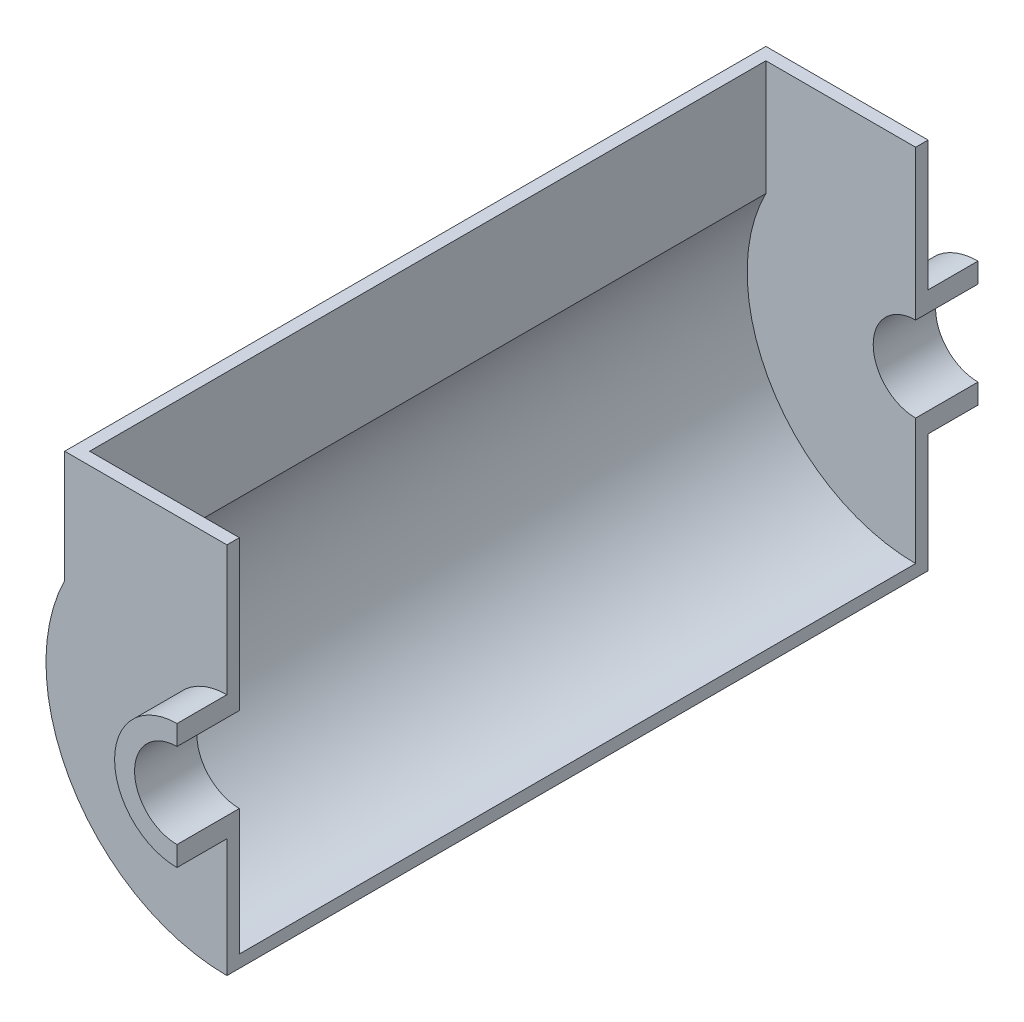
ISO-10303-21;
HEADER;
FILE_DESCRIPTION(('STEP AP214'),'2;1');
FILE_NAME('part.step','',(''),(''),'','','');
FILE_SCHEMA(('AUTOMOTIVE_DESIGN { 1 0 10303 214 1 1 1 1 }'));
ENDSEC;
DATA;
#1=APPLICATION_CONTEXT('core data for automotive mechanical design processes');
#2=APPLICATION_PROTOCOL_DEFINITION('international standard','automotive_design',2000,#1);
#3=PRODUCT_CONTEXT('',#1,'mechanical');
#4=PRODUCT('Part','Part','',(#3));
#5=PRODUCT_RELATED_PRODUCT_CATEGORY('part','',(#4));
#6=PRODUCT_DEFINITION_FORMATION('','',#4);
#7=PRODUCT_DEFINITION_CONTEXT('part definition',#1,'design');
#8=PRODUCT_DEFINITION('design','',#6,#7);
#9=PRODUCT_DEFINITION_SHAPE('','',#8);
#10=(LENGTH_UNIT() NAMED_UNIT(*) SI_UNIT(.MILLI.,.METRE.));
#11=(NAMED_UNIT(*) PLANE_ANGLE_UNIT() SI_UNIT($,.RADIAN.));
#12=(NAMED_UNIT(*) SI_UNIT($,.STERADIAN.) SOLID_ANGLE_UNIT());
#13=UNCERTAINTY_MEASURE_WITH_UNIT(LENGTH_MEASURE(1.E-05),#10,'distance_accuracy_value','');
#14=(GEOMETRIC_REPRESENTATION_CONTEXT(3) GLOBAL_UNCERTAINTY_ASSIGNED_CONTEXT((#13)) GLOBAL_UNIT_ASSIGNED_CONTEXT((#10,
#11,#12)) REPRESENTATION_CONTEXT('',''));
#15=CARTESIAN_POINT('',(0.,0.,0.));
#16=DIRECTION('',(0.,0.,1.));
#17=DIRECTION('',(1.,0.,0.));
#18=AXIS2_PLACEMENT_3D('',#15,#16,#17);
#19=CARTESIAN_POINT('',(0.,0.,-5.));
#20=DIRECTION('',(0.,0.,1.));
#21=DIRECTION('',(1.,0.,0.));
#22=AXIS2_PLACEMENT_3D('',#19,#20,#21);
#23=PLANE('',#22);
#24=CARTESIAN_POINT('',(0.,0.,-5.));
#25=DIRECTION('',(0.,0.,1.));
#26=DIRECTION('',(-1.,0.,0.));
#27=AXIS2_PLACEMENT_3D('',#24,#25,#26);
#28=CIRCLE('',#27,67.5);
#29=CARTESIAN_POINT('',(-60.,30.9232921921324,-5.));
#30=VERTEX_POINT('',#29);
#31=CARTESIAN_POINT('',(0.,-67.5,-5.));
#32=VERTEX_POINT('',#31);
#33=EDGE_CURVE('E201',#30,#32,#28,.T.);
#34=ORIENTED_EDGE('',*,*,#33,.F.);
#35=DIRECTION('',(0.,-1.,0.));
#36=VECTOR('',#35,1.);
#37=CARTESIAN_POINT('',(-60.,77.,-5.));
#38=LINE('',#37,#36);
#39=CARTESIAN_POINT('',(-60.,77.,-5.));
#40=VERTEX_POINT('',#39);
#41=EDGE_CURVE('E58',#40,#30,#38,.T.);
#42=ORIENTED_EDGE('',*,*,#41,.F.);
#43=DIRECTION('',(-1.,0.,0.));
#44=VECTOR('',#43,1.);
#45=CARTESIAN_POINT('',(0.,77.,-5.));
#46=LINE('',#45,#44);
#47=CARTESIAN_POINT('',(0.,77.,-5.));
#48=VERTEX_POINT('',#47);
#49=EDGE_CURVE('E217',#48,#40,#46,.T.);
#50=ORIENTED_EDGE('',*,*,#49,.F.);
#51=DIRECTION('',(0.,1.,0.));
#52=VECTOR('',#51,1.);
#53=CARTESIAN_POINT('',(0.,25.,-5.));
#54=LINE('',#53,#52);
#55=CARTESIAN_POINT('',(0.,17.,-5.));
#56=VERTEX_POINT('',#55);
#57=EDGE_CURVE('E259',#56,#48,#54,.T.);
#58=ORIENTED_EDGE('',*,*,#57,.F.);
#59=CARTESIAN_POINT('',(0.,0.,-5.));
#60=DIRECTION('',(0.,0.,-1.));
#61=DIRECTION('',(1.,0.,0.));
#62=AXIS2_PLACEMENT_3D('',#59,#60,#61);
#63=CIRCLE('',#62,17.);
#64=CARTESIAN_POINT('',(0.,-17.,-5.));
#65=VERTEX_POINT('',#64);
#66=EDGE_CURVE('E256',#65,#56,#63,.T.);
#67=ORIENTED_EDGE('',*,*,#66,.F.);
#68=DIRECTION('',(0.,1.,0.));
#69=VECTOR('',#68,1.);
#70=CARTESIAN_POINT('',(0.,-17.,-5.));
#71=LINE('',#70,#69);
#72=EDGE_CURVE('E64',#32,#65,#71,.T.);
#73=ORIENTED_EDGE('',*,*,#72,.F.);
#74=EDGE_LOOP('',(#34,#42,#50,#58,#67,#73));
#75=FACE_BOUND('',#74,.T.);
#76=ADVANCED_FACE('F41',(#75),#23,.F.);
#77=CARTESIAN_POINT('',(0.,0.,-5.));
#78=DIRECTION('',(0.,0.,1.));
#79=DIRECTION('',(1.,0.,0.));
#80=AXIS2_PLACEMENT_3D('',#77,#78,#79);
#81=CYLINDRICAL_SURFACE('',#80,17.);
#82=DIRECTION('',(0.,0.,1.));
#83=VECTOR('',#82,1.);
#84=CARTESIAN_POINT('',(0.,17.,-5.));
#85=LINE('',#84,#83);
#86=CARTESIAN_POINT('',(0.,17.,20.));
#87=VERTEX_POINT('',#86);
#88=EDGE_CURVE('E45',#56,#87,#85,.T.);
#89=ORIENTED_EDGE('',*,*,#88,.T.);
#90=CARTESIAN_POINT('',(0.,0.,20.));
#91=DIRECTION('',(0.,0.,-1.));
#92=DIRECTION('',(1.,0.,0.));
#93=AXIS2_PLACEMENT_3D('',#90,#91,#92);
#94=CIRCLE('',#93,17.);
#95=CARTESIAN_POINT('',(0.,-17.,20.));
#96=VERTEX_POINT('',#95);
#97=EDGE_CURVE('E239',#96,#87,#94,.T.);
#98=ORIENTED_EDGE('',*,*,#97,.F.);
#99=DIRECTION('',(0.,0.,1.));
#100=VECTOR('',#99,1.);
#101=CARTESIAN_POINT('',(0.,-17.,-5.));
#102=LINE('',#101,#100);
#103=EDGE_CURVE('E11',#65,#96,#102,.T.);
#104=ORIENTED_EDGE('',*,*,#103,.F.);
#105=ORIENTED_EDGE('',*,*,#66,.T.);
#106=EDGE_LOOP('',(#89,#98,#104,#105));
#107=FACE_BOUND('',#106,.T.);
#108=ADVANCED_FACE('F43',(#107),#81,.F.);
#109=CARTESIAN_POINT('',(0.,-17.,-5.));
#110=DIRECTION('',(1.,0.,0.));
#111=DIRECTION('',(0.,0.,-1.));
#112=AXIS2_PLACEMENT_3D('',#109,#110,#111);
#113=PLANE('',#112);
#114=ORIENTED_EDGE('',*,*,#103,.T.);
#115=DIRECTION('',(0.,1.,0.));
#116=VECTOR('',#115,1.);
#117=CARTESIAN_POINT('',(0.,-17.,20.));
#118=LINE('',#117,#116);
#119=CARTESIAN_POINT('',(0.,-25.,20.));
#120=VERTEX_POINT('',#119);
#121=EDGE_CURVE('E253',#120,#96,#118,.T.);
#122=ORIENTED_EDGE('',*,*,#121,.F.);
#123=DIRECTION('',(0.,0.,1.));
#124=VECTOR('',#123,1.);
#125=CARTESIAN_POINT('',(0.,-25.,-5.));
#126=LINE('',#125,#124);
#127=CARTESIAN_POINT('',(0.,-25.,0.));
#128=VERTEX_POINT('',#127);
#129=EDGE_CURVE('E50',#128,#120,#126,.T.);
#130=ORIENTED_EDGE('',*,*,#129,.F.);
#131=DIRECTION('',(0.,1.,0.));
#132=VECTOR('',#131,1.);
#133=CARTESIAN_POINT('',(0.,-25.,0.));
#134=LINE('',#133,#132);
#135=CARTESIAN_POINT('',(0.,-72.5,0.));
#136=VERTEX_POINT('',#135);
#137=EDGE_CURVE('E220',#136,#128,#134,.T.);
#138=ORIENTED_EDGE('',*,*,#137,.F.);
#139=DIRECTION('',(0.,0.,1.));
#140=VECTOR('',#139,1.);
#141=CARTESIAN_POINT('',(0.,-72.5,-5.));
#142=LINE('',#141,#140);
#143=CARTESIAN_POINT('',(0.,-72.5,-281.));
#144=VERTEX_POINT('',#143);
#145=EDGE_CURVE('E237',#144,#136,#142,.T.);
#146=ORIENTED_EDGE('',*,*,#145,.F.);
#147=DIRECTION('',(0.,1.,0.));
#148=VECTOR('',#147,1.);
#149=CARTESIAN_POINT('',(0.,-25.,-281.));
#150=LINE('',#149,#148);
#151=CARTESIAN_POINT('',(0.,-25.,-281.));
#152=VERTEX_POINT('',#151);
#153=EDGE_CURVE('E168',#144,#152,#150,.T.);
#154=ORIENTED_EDGE('',*,*,#153,.T.);
#155=DIRECTION('',(0.,0.,-1.));
#156=VECTOR('',#155,1.);
#157=CARTESIAN_POINT('',(0.,-25.,-276.));
#158=LINE('',#157,#156);
#159=CARTESIAN_POINT('',(0.,-25.,-301.));
#160=VERTEX_POINT('',#159);
#161=EDGE_CURVE('E194',#152,#160,#158,.T.);
#162=ORIENTED_EDGE('',*,*,#161,.T.);
#163=DIRECTION('',(0.,1.,0.));
#164=VECTOR('',#163,1.);
#165=CARTESIAN_POINT('',(0.,-17.,-301.));
#166=LINE('',#165,#164);
#167=CARTESIAN_POINT('',(0.,-17.,-301.));
#168=VERTEX_POINT('',#167);
#169=EDGE_CURVE('E187',#160,#168,#166,.T.);
#170=ORIENTED_EDGE('',*,*,#169,.T.);
#171=DIRECTION('',(0.,0.,-1.));
#172=VECTOR('',#171,1.);
#173=CARTESIAN_POINT('',(0.,-17.,-276.));
#174=LINE('',#173,#172);
#175=CARTESIAN_POINT('',(0.,-17.,-276.));
#176=VERTEX_POINT('',#175);
#177=EDGE_CURVE('E191',#176,#168,#174,.T.);
#178=ORIENTED_EDGE('',*,*,#177,.F.);
#179=DIRECTION('',(0.,1.,0.));
#180=VECTOR('',#179,1.);
#181=CARTESIAN_POINT('',(0.,-17.,-276.));
#182=LINE('',#181,#180);
#183=CARTESIAN_POINT('',(0.,-67.5,-276.));
#184=VERTEX_POINT('',#183);
#185=EDGE_CURVE('E183',#184,#176,#182,.T.);
#186=ORIENTED_EDGE('',*,*,#185,.F.);
#187=DIRECTION('',(0.,0.,1.));
#188=VECTOR('',#187,1.);
#189=CARTESIAN_POINT('',(0.,-67.5,-442.152038807834));
#190=LINE('',#189,#188);
#191=EDGE_CURVE('E204',#184,#32,#190,.T.);
#192=ORIENTED_EDGE('',*,*,#191,.T.);
#193=ORIENTED_EDGE('',*,*,#72,.T.);
#194=EDGE_LOOP('',(#114,#122,#130,#138,#146,#154,#162,#170,#178,#186,#192,#193));
#195=FACE_BOUND('',#194,.T.);
#196=ADVANCED_FACE('F277',(#195),#113,.T.);
#197=CARTESIAN_POINT('',(0.,0.,-5.));
#198=DIRECTION('',(0.,0.,1.));
#199=DIRECTION('',(1.,0.,0.));
#200=AXIS2_PLACEMENT_3D('',#197,#198,#199);
#201=CYLINDRICAL_SURFACE('',#200,25.);
#202=CARTESIAN_POINT('',(0.,0.,0.));
#203=DIRECTION('',(0.,0.,-1.));
#204=DIRECTION('',(1.,0.,0.));
#205=AXIS2_PLACEMENT_3D('',#202,#203,#204);
#206=CIRCLE('',#205,25.);
#207=CARTESIAN_POINT('',(0.,25.,0.));
#208=VERTEX_POINT('',#207);
#209=EDGE_CURVE('E210',#128,#208,#206,.T.);
#210=ORIENTED_EDGE('',*,*,#209,.F.);
#211=ORIENTED_EDGE('',*,*,#129,.T.);
#212=CARTESIAN_POINT('',(0.,0.,20.));
#213=DIRECTION('',(0.,0.,1.));
#214=DIRECTION('',(1.,0.,0.));
#215=AXIS2_PLACEMENT_3D('',#212,#213,#214);
#216=CIRCLE('',#215,25.);
#217=CARTESIAN_POINT('',(0.,25.,20.));
#218=VERTEX_POINT('',#217);
#219=EDGE_CURVE('E250',#218,#120,#216,.T.);
#220=ORIENTED_EDGE('',*,*,#219,.F.);
#221=DIRECTION('',(0.,0.,1.));
#222=VECTOR('',#221,1.);
#223=CARTESIAN_POINT('',(0.,25.,-5.));
#224=LINE('',#223,#222);
#225=EDGE_CURVE('E262',#208,#218,#224,.T.);
#226=ORIENTED_EDGE('',*,*,#225,.F.);
#227=EDGE_LOOP('',(#210,#211,#220,#226));
#228=FACE_BOUND('',#227,.T.);
#229=ADVANCED_FACE('F284',(#228),#201,.T.);
#230=CARTESIAN_POINT('',(0.,25.,-5.));
#231=DIRECTION('',(1.,0.,0.));
#232=DIRECTION('',(0.,0.,-1.));
#233=AXIS2_PLACEMENT_3D('',#230,#231,#232);
#234=PLANE('',#233);
#235=ORIENTED_EDGE('',*,*,#57,.T.);
#236=DIRECTION('',(0.,0.,1.));
#237=VECTOR('',#236,1.);
#238=CARTESIAN_POINT('',(0.,77.,-5.));
#239=LINE('',#238,#237);
#240=CARTESIAN_POINT('',(0.,77.,0.));
#241=VERTEX_POINT('',#240);
#242=EDGE_CURVE('E219',#48,#241,#239,.T.);
#243=ORIENTED_EDGE('',*,*,#242,.T.);
#244=DIRECTION('',(0.,1.,0.));
#245=VECTOR('',#244,1.);
#246=CARTESIAN_POINT('',(0.,25.,0.));
#247=LINE('',#246,#245);
#248=EDGE_CURVE('E223',#208,#241,#247,.T.);
#249=ORIENTED_EDGE('',*,*,#248,.F.);
#250=ORIENTED_EDGE('',*,*,#225,.T.);
#251=DIRECTION('',(0.,1.,0.));
#252=VECTOR('',#251,1.);
#253=CARTESIAN_POINT('',(0.,25.,20.));
#254=LINE('',#253,#252);
#255=EDGE_CURVE('E247',#87,#218,#254,.T.);
#256=ORIENTED_EDGE('',*,*,#255,.F.);
#257=ORIENTED_EDGE('',*,*,#88,.F.);
#258=EDGE_LOOP('',(#235,#243,#249,#250,#256,#257));
#259=FACE_BOUND('',#258,.T.);
#260=ADVANCED_FACE('F270',(#259),#234,.T.);
#261=CARTESIAN_POINT('',(0.,0.,20.));
#262=DIRECTION('',(0.,0.,1.));
#263=DIRECTION('',(1.,0.,0.));
#264=AXIS2_PLACEMENT_3D('',#261,#262,#263);
#265=PLANE('',#264);
#266=ORIENTED_EDGE('',*,*,#97,.T.);
#267=ORIENTED_EDGE('',*,*,#255,.T.);
#268=ORIENTED_EDGE('',*,*,#219,.T.);
#269=ORIENTED_EDGE('',*,*,#121,.T.);
#270=EDGE_LOOP('',(#266,#267,#268,#269));
#271=FACE_BOUND('',#270,.T.);
#272=ADVANCED_FACE('F273',(#271),#265,.T.);
#273=CARTESIAN_POINT('',(0.,0.,-5.));
#274=DIRECTION('',(0.,0.,1.));
#275=DIRECTION('',(1.,0.,0.));
#276=AXIS2_PLACEMENT_3D('',#273,#274,#275);
#277=CYLINDRICAL_SURFACE('',#276,72.5);
#278=CARTESIAN_POINT('',(0.,0.,0.));
#279=DIRECTION('',(0.,0.,1.));
#280=DIRECTION('',(1.,0.,0.));
#281=AXIS2_PLACEMENT_3D('',#278,#279,#280);
#282=CIRCLE('',#281,72.5);
#283=CARTESIAN_POINT('',(-65.,32.1130814466628,0.));
#284=VERTEX_POINT('',#283);
#285=EDGE_CURVE('E232',#284,#136,#282,.T.);
#286=ORIENTED_EDGE('',*,*,#285,.F.);
#287=DIRECTION('',(0.,0.,1.));
#288=VECTOR('',#287,1.);
#289=CARTESIAN_POINT('',(-65.,32.1130814466628,-5.));
#290=LINE('',#289,#288);
#291=CARTESIAN_POINT('',(-65.,32.1130814466628,-281.));
#292=VERTEX_POINT('',#291);
#293=EDGE_CURVE('E240',#292,#284,#290,.T.);
#294=ORIENTED_EDGE('',*,*,#293,.F.);
#295=CARTESIAN_POINT('',(0.,0.,-281.));
#296=DIRECTION('',(0.,0.,1.));
#297=DIRECTION('',(1.,0.,0.));
#298=AXIS2_PLACEMENT_3D('',#295,#296,#297);
#299=CIRCLE('',#298,72.5);
#300=EDGE_CURVE('E352',#292,#144,#299,.T.);
#301=ORIENTED_EDGE('',*,*,#300,.T.);
#302=ORIENTED_EDGE('',*,*,#145,.T.);
#303=EDGE_LOOP('',(#286,#294,#301,#302));
#304=FACE_BOUND('',#303,.T.);
#305=ADVANCED_FACE('F301',(#304),#277,.T.);
#306=CARTESIAN_POINT('',(-65.,77.,-5.));
#307=DIRECTION('',(-1.,0.,0.));
#308=DIRECTION('',(0.,-1.,0.));
#309=AXIS2_PLACEMENT_3D('',#306,#307,#308);
#310=PLANE('',#309);
#311=DIRECTION('',(0.,-1.,0.));
#312=VECTOR('',#311,1.);
#313=CARTESIAN_POINT('',(-65.,77.,0.));
#314=LINE('',#313,#312);
#315=CARTESIAN_POINT('',(-65.,77.,0.));
#316=VERTEX_POINT('',#315);
#317=EDGE_CURVE('E229',#316,#284,#314,.T.);
#318=ORIENTED_EDGE('',*,*,#317,.F.);
#319=DIRECTION('',(0.,0.,1.));
#320=VECTOR('',#319,1.);
#321=CARTESIAN_POINT('',(-65.,77.,-5.));
#322=LINE('',#321,#320);
#323=CARTESIAN_POINT('',(-65.,77.,-281.));
#324=VERTEX_POINT('',#323);
#325=EDGE_CURVE('E242',#324,#316,#322,.T.);
#326=ORIENTED_EDGE('',*,*,#325,.F.);
#327=DIRECTION('',(0.,-1.,0.));
#328=VECTOR('',#327,1.);
#329=CARTESIAN_POINT('',(-65.,77.,-281.));
#330=LINE('',#329,#328);
#331=EDGE_CURVE('E354',#324,#292,#330,.T.);
#332=ORIENTED_EDGE('',*,*,#331,.T.);
#333=ORIENTED_EDGE('',*,*,#293,.T.);
#334=EDGE_LOOP('',(#318,#326,#332,#333));
#335=FACE_BOUND('',#334,.T.);
#336=ADVANCED_FACE('F304',(#335),#310,.T.);
#337=CARTESIAN_POINT('',(0.,77.,-5.));
#338=DIRECTION('',(0.,1.,0.));
#339=DIRECTION('',(-1.,0.,0.));
#340=AXIS2_PLACEMENT_3D('',#337,#338,#339);
#341=PLANE('',#340);
#342=DIRECTION('',(-1.,0.,0.));
#343=VECTOR('',#342,1.);
#344=CARTESIAN_POINT('',(0.,77.,0.));
#345=LINE('',#344,#343);
#346=EDGE_CURVE('E226',#241,#316,#345,.T.);
#347=ORIENTED_EDGE('',*,*,#346,.F.);
#348=ORIENTED_EDGE('',*,*,#242,.F.);
#349=ORIENTED_EDGE('',*,*,#49,.T.);
#350=DIRECTION('',(0.,0.,1.));
#351=VECTOR('',#350,1.);
#352=CARTESIAN_POINT('',(-60.,77.,-442.152038807834));
#353=LINE('',#352,#351);
#354=CARTESIAN_POINT('',(-60.,77.,-276.));
#355=VERTEX_POINT('',#354);
#356=EDGE_CURVE('E164',#355,#40,#353,.T.);
#357=ORIENTED_EDGE('',*,*,#356,.F.);
#358=DIRECTION('',(-1.,0.,0.));
#359=VECTOR('',#358,1.);
#360=CARTESIAN_POINT('',(0.,77.,-276.));
#361=LINE('',#360,#359);
#362=CARTESIAN_POINT('',(0.,77.,-276.));
#363=VERTEX_POINT('',#362);
#364=EDGE_CURVE('E156',#363,#355,#361,.T.);
#365=ORIENTED_EDGE('',*,*,#364,.F.);
#366=DIRECTION('',(0.,0.,-1.));
#367=VECTOR('',#366,1.);
#368=CARTESIAN_POINT('',(0.,77.,-276.));
#369=LINE('',#368,#367);
#370=CARTESIAN_POINT('',(0.,77.,-281.));
#371=VERTEX_POINT('',#370);
#372=EDGE_CURVE('E161',#363,#371,#369,.T.);
#373=ORIENTED_EDGE('',*,*,#372,.T.);
#374=DIRECTION('',(-1.,0.,0.));
#375=VECTOR('',#374,1.);
#376=CARTESIAN_POINT('',(0.,77.,-281.));
#377=LINE('',#376,#375);
#378=EDGE_CURVE('E368',#371,#324,#377,.T.);
#379=ORIENTED_EDGE('',*,*,#378,.T.);
#380=ORIENTED_EDGE('',*,*,#325,.T.);
#381=EDGE_LOOP('',(#347,#348,#349,#357,#365,#373,#379,#380));
#382=FACE_BOUND('',#381,.T.);
#383=ADVANCED_FACE('F159',(#382),#341,.T.);
#384=CARTESIAN_POINT('',(0.,0.,0.));
#385=DIRECTION('',(0.,0.,1.));
#386=DIRECTION('',(1.,0.,0.));
#387=AXIS2_PLACEMENT_3D('',#384,#385,#386);
#388=PLANE('',#387);
#389=ORIENTED_EDGE('',*,*,#209,.T.);
#390=ORIENTED_EDGE('',*,*,#248,.T.);
#391=ORIENTED_EDGE('',*,*,#346,.T.);
#392=ORIENTED_EDGE('',*,*,#317,.T.);
#393=ORIENTED_EDGE('',*,*,#285,.T.);
#394=ORIENTED_EDGE('',*,*,#137,.T.);
#395=EDGE_LOOP('',(#389,#390,#391,#392,#393,#394));
#396=FACE_BOUND('',#395,.T.);
#397=ADVANCED_FACE('F282',(#396),#388,.T.);
#398=CARTESIAN_POINT('',(-60.,77.,-442.152038807834));
#399=DIRECTION('',(-1.,0.,0.));
#400=DIRECTION('',(0.,0.,1.));
#401=AXIS2_PLACEMENT_3D('',#398,#399,#400);
#402=PLANE('',#401);
#403=DIRECTION('',(0.,-1.,0.));
#404=VECTOR('',#403,1.);
#405=CARTESIAN_POINT('',(-60.,77.,-276.));
#406=LINE('',#405,#404);
#407=CARTESIAN_POINT('',(-60.,30.9232921921324,-276.));
#408=VERTEX_POINT('',#407);
#409=EDGE_CURVE('E211',#355,#408,#406,.T.);
#410=ORIENTED_EDGE('',*,*,#409,.F.);
#411=ORIENTED_EDGE('',*,*,#356,.T.);
#412=ORIENTED_EDGE('',*,*,#41,.T.);
#413=DIRECTION('',(0.,0.,1.));
#414=VECTOR('',#413,1.);
#415=CARTESIAN_POINT('',(-60.,30.9232921921324,-442.152038807834));
#416=LINE('',#415,#414);
#417=EDGE_CURVE('E205',#408,#30,#416,.T.);
#418=ORIENTED_EDGE('',*,*,#417,.F.);
#419=EDGE_LOOP('',(#410,#411,#412,#418));
#420=FACE_BOUND('',#419,.T.);
#421=ADVANCED_FACE('F312',(#420),#402,.F.);
#422=CARTESIAN_POINT('',(0.,0.,-442.152038807834));
#423=DIRECTION('',(0.,0.,1.));
#424=DIRECTION('',(1.,0.,0.));
#425=AXIS2_PLACEMENT_3D('',#422,#423,#424);
#426=CYLINDRICAL_SURFACE('',#425,67.5);
#427=CARTESIAN_POINT('',(0.,0.,-276.));
#428=DIRECTION('',(0.,0.,-1.));
#429=DIRECTION('',(-1.,0.,0.));
#430=AXIS2_PLACEMENT_3D('',#427,#428,#429);
#431=CIRCLE('',#430,67.5);
#432=EDGE_CURVE('E207',#408,#184,#431,.F.);
#433=ORIENTED_EDGE('',*,*,#432,.F.);
#434=ORIENTED_EDGE('',*,*,#417,.T.);
#435=ORIENTED_EDGE('',*,*,#33,.T.);
#436=ORIENTED_EDGE('',*,*,#191,.F.);
#437=EDGE_LOOP('',(#433,#434,#435,#436));
#438=FACE_BOUND('',#437,.T.);
#439=ADVANCED_FACE('F315',(#438),#426,.F.);
#440=CARTESIAN_POINT('',(0.,0.,-276.));
#441=DIRECTION('',(0.,0.,-1.));
#442=DIRECTION('',(1.,0.,0.));
#443=AXIS2_PLACEMENT_3D('',#440,#441,#442);
#444=PLANE('',#443);
#445=ORIENTED_EDGE('',*,*,#364,.T.);
#446=ORIENTED_EDGE('',*,*,#409,.T.);
#447=ORIENTED_EDGE('',*,*,#432,.T.);
#448=ORIENTED_EDGE('',*,*,#185,.T.);
#449=CARTESIAN_POINT('',(0.,0.,-276.));
#450=DIRECTION('',(0.,0.,-1.));
#451=DIRECTION('',(1.,0.,0.));
#452=AXIS2_PLACEMENT_3D('',#449,#450,#451);
#453=CIRCLE('',#452,17.);
#454=CARTESIAN_POINT('',(0.,17.,-276.));
#455=VERTEX_POINT('',#454);
#456=EDGE_CURVE('E181',#176,#455,#453,.T.);
#457=ORIENTED_EDGE('',*,*,#456,.T.);
#458=DIRECTION('',(0.,1.,0.));
#459=VECTOR('',#458,1.);
#460=CARTESIAN_POINT('',(0.,25.,-276.));
#461=LINE('',#460,#459);
#462=EDGE_CURVE('E173',#455,#363,#461,.T.);
#463=ORIENTED_EDGE('',*,*,#462,.T.);
#464=EDGE_LOOP('',(#445,#446,#447,#448,#457,#463));
#465=FACE_BOUND('',#464,.T.);
#466=ADVANCED_FACE('F179',(#465),#444,.F.);
#467=CARTESIAN_POINT('',(0.,0.,-276.));
#468=DIRECTION('',(0.,0.,-1.));
#469=DIRECTION('',(1.,0.,0.));
#470=AXIS2_PLACEMENT_3D('',#467,#468,#469);
#471=CYLINDRICAL_SURFACE('',#470,17.);
#472=DIRECTION('',(0.,0.,-1.));
#473=VECTOR('',#472,1.);
#474=CARTESIAN_POINT('',(0.,17.,-276.));
#475=LINE('',#474,#473);
#476=CARTESIAN_POINT('',(0.,17.,-301.));
#477=VERTEX_POINT('',#476);
#478=EDGE_CURVE('E185',#455,#477,#475,.T.);
#479=ORIENTED_EDGE('',*,*,#478,.F.);
#480=ORIENTED_EDGE('',*,*,#456,.F.);
#481=ORIENTED_EDGE('',*,*,#177,.T.);
#482=CARTESIAN_POINT('',(0.,0.,-301.));
#483=DIRECTION('',(0.,0.,-1.));
#484=DIRECTION('',(1.,0.,0.));
#485=AXIS2_PLACEMENT_3D('',#482,#483,#484);
#486=CIRCLE('',#485,17.);
#487=EDGE_CURVE('E177',#168,#477,#486,.T.);
#488=ORIENTED_EDGE('',*,*,#487,.T.);
#489=EDGE_LOOP('',(#479,#480,#481,#488));
#490=FACE_BOUND('',#489,.T.);
#491=ADVANCED_FACE('F320',(#490),#471,.F.);
#492=CARTESIAN_POINT('',(0.,0.,-276.));
#493=DIRECTION('',(0.,0.,-1.));
#494=DIRECTION('',(1.,0.,0.));
#495=AXIS2_PLACEMENT_3D('',#492,#493,#494);
#496=CYLINDRICAL_SURFACE('',#495,25.);
#497=CARTESIAN_POINT('',(0.,0.,-281.));
#498=DIRECTION('',(0.,0.,-1.));
#499=DIRECTION('',(1.,0.,0.));
#500=AXIS2_PLACEMENT_3D('',#497,#498,#499);
#501=CIRCLE('',#500,25.);
#502=CARTESIAN_POINT('',(0.,25.,-281.));
#503=VERTEX_POINT('',#502);
#504=EDGE_CURVE('E343',#152,#503,#501,.T.);
#505=ORIENTED_EDGE('',*,*,#504,.T.);
#506=DIRECTION('',(0.,0.,-1.));
#507=VECTOR('',#506,1.);
#508=CARTESIAN_POINT('',(0.,25.,-276.));
#509=LINE('',#508,#507);
#510=CARTESIAN_POINT('',(0.,25.,-301.));
#511=VERTEX_POINT('',#510);
#512=EDGE_CURVE('E197',#503,#511,#509,.T.);
#513=ORIENTED_EDGE('',*,*,#512,.T.);
#514=CARTESIAN_POINT('',(0.,0.,-301.));
#515=DIRECTION('',(0.,0.,1.));
#516=DIRECTION('',(1.,0.,0.));
#517=AXIS2_PLACEMENT_3D('',#514,#515,#516);
#518=CIRCLE('',#517,25.);
#519=EDGE_CURVE('E349',#511,#160,#518,.T.);
#520=ORIENTED_EDGE('',*,*,#519,.T.);
#521=ORIENTED_EDGE('',*,*,#161,.F.);
#522=EDGE_LOOP('',(#505,#513,#520,#521));
#523=FACE_BOUND('',#522,.T.);
#524=ADVANCED_FACE('F323',(#523),#496,.T.);
#525=CARTESIAN_POINT('',(0.,25.,-276.));
#526=DIRECTION('',(1.,0.,0.));
#527=DIRECTION('',(0.,0.,1.));
#528=AXIS2_PLACEMENT_3D('',#525,#526,#527);
#529=PLANE('',#528);
#530=ORIENTED_EDGE('',*,*,#462,.F.);
#531=ORIENTED_EDGE('',*,*,#478,.T.);
#532=DIRECTION('',(0.,1.,0.));
#533=VECTOR('',#532,1.);
#534=CARTESIAN_POINT('',(0.,25.,-301.));
#535=LINE('',#534,#533);
#536=EDGE_CURVE('E360',#477,#511,#535,.T.);
#537=ORIENTED_EDGE('',*,*,#536,.T.);
#538=ORIENTED_EDGE('',*,*,#512,.F.);
#539=DIRECTION('',(0.,1.,0.));
#540=VECTOR('',#539,1.);
#541=CARTESIAN_POINT('',(0.,25.,-281.));
#542=LINE('',#541,#540);
#543=EDGE_CURVE('E176',#503,#371,#542,.T.);
#544=ORIENTED_EDGE('',*,*,#543,.T.);
#545=ORIENTED_EDGE('',*,*,#372,.F.);
#546=EDGE_LOOP('',(#530,#531,#537,#538,#544,#545));
#547=FACE_BOUND('',#546,.T.);
#548=ADVANCED_FACE('F171',(#547),#529,.T.);
#549=CARTESIAN_POINT('',(0.,0.,-301.));
#550=DIRECTION('',(0.,0.,-1.));
#551=DIRECTION('',(1.,0.,0.));
#552=AXIS2_PLACEMENT_3D('',#549,#550,#551);
#553=PLANE('',#552);
#554=ORIENTED_EDGE('',*,*,#487,.F.);
#555=ORIENTED_EDGE('',*,*,#169,.F.);
#556=ORIENTED_EDGE('',*,*,#519,.F.);
#557=ORIENTED_EDGE('',*,*,#536,.F.);
#558=EDGE_LOOP('',(#554,#555,#556,#557));
#559=FACE_BOUND('',#558,.T.);
#560=ADVANCED_FACE('F327',(#559),#553,.T.);
#561=CARTESIAN_POINT('',(0.,0.,-281.));
#562=DIRECTION('',(0.,0.,-1.));
#563=DIRECTION('',(1.,0.,0.));
#564=AXIS2_PLACEMENT_3D('',#561,#562,#563);
#565=PLANE('',#564);
#566=ORIENTED_EDGE('',*,*,#504,.F.);
#567=ORIENTED_EDGE('',*,*,#153,.F.);
#568=ORIENTED_EDGE('',*,*,#300,.F.);
#569=ORIENTED_EDGE('',*,*,#331,.F.);
#570=ORIENTED_EDGE('',*,*,#378,.F.);
#571=ORIENTED_EDGE('',*,*,#543,.F.);
#572=EDGE_LOOP('',(#566,#567,#568,#569,#570,#571));
#573=FACE_BOUND('',#572,.T.);
#574=ADVANCED_FACE('F335',(#573),#565,.T.);
#575=CLOSED_SHELL('',(#76,#108,#196,#229,#260,#272,#305,#336,#383,#397,#421,#439,#466,#491,#524,
#548,#560,#574));
#576=MANIFOLD_SOLID_BREP('B2',#575);
#577=ADVANCED_BREP_SHAPE_REPRESENTATION('',(#18,#576),#14);
#578=SHAPE_DEFINITION_REPRESENTATION(#9,#577);
ENDSEC;
END-ISO-10303-21;
